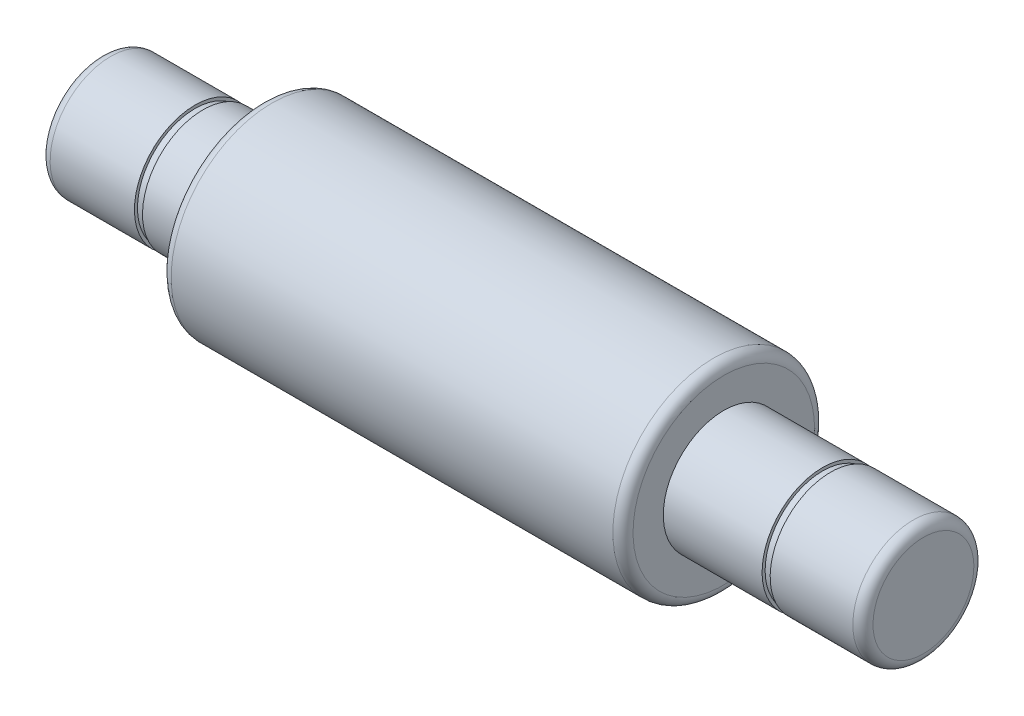
ISO-10303-21;
HEADER;
FILE_DESCRIPTION(('STEP AP214'),'2;1');
FILE_NAME('part.step','',(''),(''),'','','');
FILE_SCHEMA(('AUTOMOTIVE_DESIGN { 1 0 10303 214 1 1 1 1 }'));
ENDSEC;
DATA;
#1=APPLICATION_CONTEXT('core data for automotive mechanical design processes');
#2=APPLICATION_PROTOCOL_DEFINITION('international standard','automotive_design',2000,#1);
#3=PRODUCT_CONTEXT('',#1,'mechanical');
#4=PRODUCT('Part','Part','',(#3));
#5=PRODUCT_RELATED_PRODUCT_CATEGORY('part','',(#4));
#6=PRODUCT_DEFINITION_FORMATION('','',#4);
#7=PRODUCT_DEFINITION_CONTEXT('part definition',#1,'design');
#8=PRODUCT_DEFINITION('design','',#6,#7);
#9=PRODUCT_DEFINITION_SHAPE('','',#8);
#10=(LENGTH_UNIT() NAMED_UNIT(*) SI_UNIT(.MILLI.,.METRE.));
#11=(NAMED_UNIT(*) PLANE_ANGLE_UNIT() SI_UNIT($,.RADIAN.));
#12=(NAMED_UNIT(*) SI_UNIT($,.STERADIAN.) SOLID_ANGLE_UNIT());
#13=UNCERTAINTY_MEASURE_WITH_UNIT(LENGTH_MEASURE(1.E-05),#10,'distance_accuracy_value','');
#14=(GEOMETRIC_REPRESENTATION_CONTEXT(3) GLOBAL_UNCERTAINTY_ASSIGNED_CONTEXT((#13)) GLOBAL_UNIT_ASSIGNED_CONTEXT((#10,
#11,#12)) REPRESENTATION_CONTEXT('',''));
#15=CARTESIAN_POINT('',(0.,0.,0.));
#16=DIRECTION('',(0.,0.,1.));
#17=DIRECTION('',(1.,0.,0.));
#18=AXIS2_PLACEMENT_3D('',#15,#16,#17);
#19=CARTESIAN_POINT('',(-20.4,0.,0.));
#20=DIRECTION('',(-1.,0.,0.));
#21=DIRECTION('',(0.,-1.,0.));
#22=AXIS2_PLACEMENT_3D('',#19,#20,#21);
#23=CYLINDRICAL_SURFACE('',#22,5.);
#24=CARTESIAN_POINT('',(-11.9,0.,0.));
#25=DIRECTION('',(1.,0.,0.));
#26=DIRECTION('',(0.,1.,0.));
#27=AXIS2_PLACEMENT_3D('',#24,#25,#26);
#28=CIRCLE('',#27,5.);
#29=CARTESIAN_POINT('',(-11.9,5.,0.));
#30=VERTEX_POINT('',#29);
#31=EDGE_CURVE('E49',#30,#30,#28,.T.);
#32=ORIENTED_EDGE('',*,*,#31,.T.);
#33=EDGE_LOOP('',(#32));
#34=FACE_BOUND('',#33,.T.);
#35=CARTESIAN_POINT('',(10.,0.,0.));
#36=DIRECTION('',(1.,0.,0.));
#37=DIRECTION('',(0.,1.,0.));
#38=AXIS2_PLACEMENT_3D('',#35,#36,#37);
#39=CIRCLE('',#38,5.);
#40=CARTESIAN_POINT('',(10.,5.,0.));
#41=VERTEX_POINT('',#40);
#42=EDGE_CURVE('E54',#41,#41,#39,.F.);
#43=ORIENTED_EDGE('',*,*,#42,.T.);
#44=EDGE_LOOP('',(#43));
#45=FACE_BOUND('',#44,.T.);
#46=ADVANCED_FACE('F34',(#34,#45),#23,.T.);
#47=CARTESIAN_POINT('',(-12.4,5.,0.));
#48=DIRECTION('',(1.,0.,0.));
#49=DIRECTION('',(0.,1.,0.));
#50=AXIS2_PLACEMENT_3D('',#47,#48,#49);
#51=PLANE('',#50);
#52=CARTESIAN_POINT('',(-12.4,0.,0.));
#53=DIRECTION('',(1.,0.,0.));
#54=DIRECTION('',(0.,1.,0.));
#55=AXIS2_PLACEMENT_3D('',#52,#53,#54);
#56=CIRCLE('',#55,4.5);
#57=CARTESIAN_POINT('',(-12.4,4.5,0.));
#58=VERTEX_POINT('',#57);
#59=EDGE_CURVE('E57',#58,#58,#56,.F.);
#60=ORIENTED_EDGE('',*,*,#59,.T.);
#61=EDGE_LOOP('',(#60));
#62=FACE_BOUND('',#61,.T.);
#63=CARTESIAN_POINT('',(-12.4,0.,0.));
#64=DIRECTION('',(-1.,0.,0.));
#65=DIRECTION('',(0.,-1.,0.));
#66=AXIS2_PLACEMENT_3D('',#63,#64,#65);
#67=CIRCLE('',#66,3.);
#68=CARTESIAN_POINT('',(-12.4,-3.,0.));
#69=VERTEX_POINT('',#68);
#70=EDGE_CURVE('E66',#69,#69,#67,.T.);
#71=ORIENTED_EDGE('',*,*,#70,.F.);
#72=EDGE_LOOP('',(#71));
#73=FACE_BOUND('',#72,.T.);
#74=ADVANCED_FACE('F117',(#62,#73),#51,.F.);
#75=CARTESIAN_POINT('',(-20.4,0.,0.));
#76=DIRECTION('',(-1.,0.,0.));
#77=DIRECTION('',(0.,-1.,0.));
#78=AXIS2_PLACEMENT_3D('',#75,#76,#77);
#79=CYLINDRICAL_SURFACE('',#78,3.);
#80=CARTESIAN_POINT('',(-15.32,0.,0.));
#81=DIRECTION('',(-1.,0.,0.));
#82=DIRECTION('',(0.,-1.,0.));
#83=AXIS2_PLACEMENT_3D('',#80,#81,#82);
#84=CIRCLE('',#83,3.);
#85=CARTESIAN_POINT('',(-15.32,-3.,0.));
#86=VERTEX_POINT('',#85);
#87=EDGE_CURVE('E69',#86,#86,#84,.T.);
#88=ORIENTED_EDGE('',*,*,#87,.F.);
#89=EDGE_LOOP('',(#88));
#90=FACE_BOUND('',#89,.T.);
#91=ORIENTED_EDGE('',*,*,#70,.T.);
#92=EDGE_LOOP('',(#91));
#93=FACE_BOUND('',#92,.T.);
#94=ADVANCED_FACE('F123',(#90,#93),#79,.T.);
#95=CARTESIAN_POINT('',(-15.32,3.,0.));
#96=DIRECTION('',(1.,0.,0.));
#97=DIRECTION('',(0.,1.,0.));
#98=AXIS2_PLACEMENT_3D('',#95,#96,#97);
#99=PLANE('',#98);
#100=CARTESIAN_POINT('',(-15.32,0.,0.));
#101=DIRECTION('',(-1.,0.,0.));
#102=DIRECTION('',(0.,-1.,0.));
#103=AXIS2_PLACEMENT_3D('',#100,#101,#102);
#104=CIRCLE('',#103,2.85);
#105=CARTESIAN_POINT('',(-15.32,-2.85,0.));
#106=VERTEX_POINT('',#105);
#107=EDGE_CURVE('E72',#106,#106,#104,.T.);
#108=ORIENTED_EDGE('',*,*,#107,.F.);
#109=EDGE_LOOP('',(#108));
#110=FACE_BOUND('',#109,.T.);
#111=ORIENTED_EDGE('',*,*,#87,.T.);
#112=EDGE_LOOP('',(#111));
#113=FACE_BOUND('',#112,.T.);
#114=ADVANCED_FACE('F169',(#110,#113),#99,.F.);
#115=CARTESIAN_POINT('',(-20.4,0.,0.));
#116=DIRECTION('',(-1.,0.,0.));
#117=DIRECTION('',(0.,-1.,0.));
#118=AXIS2_PLACEMENT_3D('',#115,#116,#117);
#119=CYLINDRICAL_SURFACE('',#118,2.85);
#120=CARTESIAN_POINT('',(-15.72,0.,0.));
#121=DIRECTION('',(1.,0.,0.));
#122=DIRECTION('',(0.,1.,0.));
#123=AXIS2_PLACEMENT_3D('',#120,#121,#122);
#124=CIRCLE('',#123,2.85);
#125=CARTESIAN_POINT('',(-15.72,2.85,0.));
#126=VERTEX_POINT('',#125);
#127=EDGE_CURVE('E81',#126,#126,#124,.T.);
#128=ORIENTED_EDGE('',*,*,#127,.T.);
#129=EDGE_LOOP('',(#128));
#130=FACE_BOUND('',#129,.T.);
#131=ORIENTED_EDGE('',*,*,#107,.T.);
#132=EDGE_LOOP('',(#131));
#133=FACE_BOUND('',#132,.T.);
#134=ADVANCED_FACE('F165',(#130,#133),#119,.T.);
#135=CARTESIAN_POINT('',(10.5,0.,0.));
#136=DIRECTION('',(1.,0.,0.));
#137=DIRECTION('',(0.,1.,0.));
#138=AXIS2_PLACEMENT_3D('',#135,#136,#137);
#139=PLANE('',#138);
#140=CARTESIAN_POINT('',(10.5,0.,0.));
#141=DIRECTION('',(1.,0.,0.));
#142=DIRECTION('',(0.,1.,0.));
#143=AXIS2_PLACEMENT_3D('',#140,#141,#142);
#144=CIRCLE('',#143,4.5);
#145=CARTESIAN_POINT('',(10.5,4.5,0.));
#146=VERTEX_POINT('',#145);
#147=EDGE_CURVE('E10',#146,#146,#144,.T.);
#148=ORIENTED_EDGE('',*,*,#147,.T.);
#149=EDGE_LOOP('',(#148));
#150=FACE_BOUND('',#149,.T.);
#151=CARTESIAN_POINT('',(10.5,0.,0.));
#152=DIRECTION('',(1.,0.,0.));
#153=DIRECTION('',(0.,1.,0.));
#154=AXIS2_PLACEMENT_3D('',#151,#152,#153);
#155=CIRCLE('',#154,3.);
#156=CARTESIAN_POINT('',(10.5,3.,0.));
#157=VERTEX_POINT('',#156);
#158=EDGE_CURVE('E75',#157,#157,#155,.T.);
#159=ORIENTED_EDGE('',*,*,#158,.F.);
#160=EDGE_LOOP('',(#159));
#161=FACE_BOUND('',#160,.T.);
#162=ADVANCED_FACE('F168',(#150,#161),#139,.T.);
#163=CARTESIAN_POINT('',(-20.4,0.,0.));
#164=DIRECTION('',(-1.,0.,0.));
#165=DIRECTION('',(0.,-1.,0.));
#166=AXIS2_PLACEMENT_3D('',#163,#164,#165);
#167=CYLINDRICAL_SURFACE('',#166,3.);
#168=ORIENTED_EDGE('',*,*,#158,.T.);
#169=EDGE_LOOP('',(#168));
#170=FACE_BOUND('',#169,.T.);
#171=CARTESIAN_POINT('',(15.4,0.,0.));
#172=DIRECTION('',(1.,0.,0.));
#173=DIRECTION('',(0.,1.,0.));
#174=AXIS2_PLACEMENT_3D('',#171,#172,#173);
#175=CIRCLE('',#174,3.);
#176=CARTESIAN_POINT('',(15.4,3.,0.));
#177=VERTEX_POINT('',#176);
#178=EDGE_CURVE('E90',#177,#177,#175,.T.);
#179=ORIENTED_EDGE('',*,*,#178,.F.);
#180=EDGE_LOOP('',(#179));
#181=FACE_BOUND('',#180,.T.);
#182=ADVANCED_FACE('F135',(#170,#181),#167,.T.);
#183=CARTESIAN_POINT('',(-11.9,0.,0.));
#184=DIRECTION('',(1.,0.,0.));
#185=DIRECTION('',(0.,1.,0.));
#186=AXIS2_PLACEMENT_3D('',#183,#184,#185);
#187=TOROIDAL_SURFACE('',#186,4.5,0.5);
#188=ORIENTED_EDGE('',*,*,#31,.F.);
#189=EDGE_LOOP('',(#188));
#190=FACE_BOUND('',#189,.T.);
#191=ORIENTED_EDGE('',*,*,#59,.F.);
#192=EDGE_LOOP('',(#191));
#193=FACE_BOUND('',#192,.T.);
#194=ADVANCED_FACE('F133',(#190,#193),#187,.T.);
#195=CARTESIAN_POINT('',(10.,0.,0.));
#196=DIRECTION('',(1.,0.,0.));
#197=DIRECTION('',(0.,1.,0.));
#198=AXIS2_PLACEMENT_3D('',#195,#196,#197);
#199=TOROIDAL_SURFACE('',#198,4.5,0.5);
#200=ORIENTED_EDGE('',*,*,#42,.F.);
#201=EDGE_LOOP('',(#200));
#202=FACE_BOUND('',#201,.T.);
#203=ORIENTED_EDGE('',*,*,#147,.F.);
#204=EDGE_LOOP('',(#203));
#205=FACE_BOUND('',#204,.T.);
#206=ADVANCED_FACE('F36',(#202,#205),#199,.T.);
#207=CARTESIAN_POINT('',(-15.72,0.,0.));
#208=DIRECTION('',(1.,0.,0.));
#209=DIRECTION('',(0.,1.,0.));
#210=AXIS2_PLACEMENT_3D('',#207,#208,#209);
#211=PLANE('',#210);
#212=CARTESIAN_POINT('',(-15.72,0.,0.));
#213=DIRECTION('',(1.,0.,0.));
#214=DIRECTION('',(0.,1.,0.));
#215=AXIS2_PLACEMENT_3D('',#212,#213,#214);
#216=CIRCLE('',#215,3.);
#217=CARTESIAN_POINT('',(-15.72,3.,0.));
#218=VERTEX_POINT('',#217);
#219=EDGE_CURVE('E78',#218,#218,#216,.T.);
#220=ORIENTED_EDGE('',*,*,#219,.T.);
#221=EDGE_LOOP('',(#220));
#222=FACE_BOUND('',#221,.T.);
#223=ORIENTED_EDGE('',*,*,#127,.F.);
#224=EDGE_LOOP('',(#223));
#225=FACE_BOUND('',#224,.T.);
#226=ADVANCED_FACE('F162',(#222,#225),#211,.T.);
#227=CARTESIAN_POINT('',(-20.4,3.,0.));
#228=DIRECTION('',(1.,0.,0.));
#229=DIRECTION('',(0.,1.,0.));
#230=AXIS2_PLACEMENT_3D('',#227,#228,#229);
#231=PLANE('',#230);
#232=CARTESIAN_POINT('',(-20.4,0.,0.));
#233=DIRECTION('',(1.,0.,0.));
#234=DIRECTION('',(0.,1.,0.));
#235=AXIS2_PLACEMENT_3D('',#232,#233,#234);
#236=CIRCLE('',#235,2.5);
#237=CARTESIAN_POINT('',(-20.4,2.5,0.));
#238=VERTEX_POINT('',#237);
#239=EDGE_CURVE('E63',#238,#238,#236,.F.);
#240=ORIENTED_EDGE('',*,*,#239,.T.);
#241=EDGE_LOOP('',(#240));
#242=FACE_BOUND('',#241,.T.);
#243=ADVANCED_FACE('F131',(#242),#231,.F.);
#244=CARTESIAN_POINT('',(-19.9,0.,0.));
#245=DIRECTION('',(1.,0.,0.));
#246=DIRECTION('',(0.,1.,0.));
#247=AXIS2_PLACEMENT_3D('',#244,#245,#246);
#248=TOROIDAL_SURFACE('',#247,2.5,0.5);
#249=CARTESIAN_POINT('',(-19.9,0.,0.));
#250=DIRECTION('',(1.,0.,0.));
#251=DIRECTION('',(0.,1.,0.));
#252=AXIS2_PLACEMENT_3D('',#249,#250,#251);
#253=CIRCLE('',#252,3.);
#254=CARTESIAN_POINT('',(-19.9,3.,0.));
#255=VERTEX_POINT('',#254);
#256=EDGE_CURVE('E60',#255,#255,#253,.T.);
#257=ORIENTED_EDGE('',*,*,#256,.F.);
#258=EDGE_LOOP('',(#257));
#259=FACE_BOUND('',#258,.T.);
#260=ORIENTED_EDGE('',*,*,#239,.F.);
#261=EDGE_LOOP('',(#260));
#262=FACE_BOUND('',#261,.T.);
#263=ADVANCED_FACE('F112',(#259,#262),#248,.T.);
#264=CARTESIAN_POINT('',(-20.4,0.,0.));
#265=DIRECTION('',(-1.,0.,0.));
#266=DIRECTION('',(0.,-1.,0.));
#267=AXIS2_PLACEMENT_3D('',#264,#265,#266);
#268=CYLINDRICAL_SURFACE('',#267,3.);
#269=ORIENTED_EDGE('',*,*,#256,.T.);
#270=EDGE_LOOP('',(#269));
#271=FACE_BOUND('',#270,.T.);
#272=ORIENTED_EDGE('',*,*,#219,.F.);
#273=EDGE_LOOP('',(#272));
#274=FACE_BOUND('',#273,.T.);
#275=ADVANCED_FACE('F103',(#271,#274),#268,.T.);
#276=CARTESIAN_POINT('',(15.4,0.,0.));
#277=DIRECTION('',(1.,0.,0.));
#278=DIRECTION('',(0.,1.,0.));
#279=AXIS2_PLACEMENT_3D('',#276,#277,#278);
#280=PLANE('',#279);
#281=ORIENTED_EDGE('',*,*,#178,.T.);
#282=EDGE_LOOP('',(#281));
#283=FACE_BOUND('',#282,.T.);
#284=CARTESIAN_POINT('',(15.4,0.,0.));
#285=DIRECTION('',(1.,0.,0.));
#286=DIRECTION('',(0.,1.,0.));
#287=AXIS2_PLACEMENT_3D('',#284,#285,#286);
#288=CIRCLE('',#287,2.85);
#289=CARTESIAN_POINT('',(15.4,2.85,0.));
#290=VERTEX_POINT('',#289);
#291=EDGE_CURVE('E93',#290,#290,#288,.T.);
#292=ORIENTED_EDGE('',*,*,#291,.F.);
#293=EDGE_LOOP('',(#292));
#294=FACE_BOUND('',#293,.T.);
#295=ADVANCED_FACE('F100',(#283,#294),#280,.T.);
#296=CARTESIAN_POINT('',(20.4,3.,0.));
#297=DIRECTION('',(-1.,0.,0.));
#298=DIRECTION('',(0.,-1.,0.));
#299=AXIS2_PLACEMENT_3D('',#296,#297,#298);
#300=PLANE('',#299);
#301=CARTESIAN_POINT('',(20.4,0.,0.));
#302=DIRECTION('',(-1.,0.,0.));
#303=DIRECTION('',(0.,-1.,0.));
#304=AXIS2_PLACEMENT_3D('',#301,#302,#303);
#305=CIRCLE('',#304,2.5);
#306=CARTESIAN_POINT('',(20.4,-2.5,0.));
#307=VERTEX_POINT('',#306);
#308=EDGE_CURVE('E41',#307,#307,#305,.F.);
#309=ORIENTED_EDGE('',*,*,#308,.T.);
#310=EDGE_LOOP('',(#309));
#311=FACE_BOUND('',#310,.T.);
#312=ADVANCED_FACE('F102',(#311),#300,.F.);
#313=CARTESIAN_POINT('',(19.9,0.,0.));
#314=DIRECTION('',(-1.,0.,0.));
#315=DIRECTION('',(0.,-1.,0.));
#316=AXIS2_PLACEMENT_3D('',#313,#314,#315);
#317=TOROIDAL_SURFACE('',#316,2.5,0.5);
#318=ORIENTED_EDGE('',*,*,#308,.F.);
#319=EDGE_LOOP('',(#318));
#320=FACE_BOUND('',#319,.T.);
#321=CARTESIAN_POINT('',(19.9,0.,0.));
#322=DIRECTION('',(-1.,0.,0.));
#323=DIRECTION('',(0.,-1.,0.));
#324=AXIS2_PLACEMENT_3D('',#321,#322,#323);
#325=CIRCLE('',#324,3.);
#326=CARTESIAN_POINT('',(19.9,-3.,0.));
#327=VERTEX_POINT('',#326);
#328=EDGE_CURVE('E45',#327,#327,#325,.T.);
#329=ORIENTED_EDGE('',*,*,#328,.F.);
#330=EDGE_LOOP('',(#329));
#331=FACE_BOUND('',#330,.T.);
#332=ADVANCED_FACE('F110',(#320,#331),#317,.T.);
#333=CARTESIAN_POINT('',(-20.4,0.,0.));
#334=DIRECTION('',(-1.,0.,0.));
#335=DIRECTION('',(0.,-1.,0.));
#336=AXIS2_PLACEMENT_3D('',#333,#334,#335);
#337=CYLINDRICAL_SURFACE('',#336,3.);
#338=ORIENTED_EDGE('',*,*,#328,.T.);
#339=EDGE_LOOP('',(#338));
#340=FACE_BOUND('',#339,.T.);
#341=CARTESIAN_POINT('',(15.8,0.,0.));
#342=DIRECTION('',(-1.,0.,0.));
#343=DIRECTION('',(0.,-1.,0.));
#344=AXIS2_PLACEMENT_3D('',#341,#342,#343);
#345=CIRCLE('',#344,3.);
#346=CARTESIAN_POINT('',(15.8,-3.,0.));
#347=VERTEX_POINT('',#346);
#348=EDGE_CURVE('E84',#347,#347,#345,.T.);
#349=ORIENTED_EDGE('',*,*,#348,.F.);
#350=EDGE_LOOP('',(#349));
#351=FACE_BOUND('',#350,.T.);
#352=ADVANCED_FACE('F138',(#340,#351),#337,.T.);
#353=CARTESIAN_POINT('',(15.8,0.,0.));
#354=DIRECTION('',(-1.,0.,0.));
#355=DIRECTION('',(0.,-1.,0.));
#356=AXIS2_PLACEMENT_3D('',#353,#354,#355);
#357=PLANE('',#356);
#358=ORIENTED_EDGE('',*,*,#348,.T.);
#359=EDGE_LOOP('',(#358));
#360=FACE_BOUND('',#359,.T.);
#361=CARTESIAN_POINT('',(15.8,0.,0.));
#362=DIRECTION('',(-1.,0.,0.));
#363=DIRECTION('',(0.,-1.,0.));
#364=AXIS2_PLACEMENT_3D('',#361,#362,#363);
#365=CIRCLE('',#364,2.85);
#366=CARTESIAN_POINT('',(15.8,-2.85,0.));
#367=VERTEX_POINT('',#366);
#368=EDGE_CURVE('E87',#367,#367,#365,.T.);
#369=ORIENTED_EDGE('',*,*,#368,.F.);
#370=EDGE_LOOP('',(#369));
#371=FACE_BOUND('',#370,.T.);
#372=ADVANCED_FACE('F143',(#360,#371),#357,.T.);
#373=CARTESIAN_POINT('',(-20.4,0.,0.));
#374=DIRECTION('',(-1.,0.,0.));
#375=DIRECTION('',(0.,-1.,0.));
#376=AXIS2_PLACEMENT_3D('',#373,#374,#375);
#377=CYLINDRICAL_SURFACE('',#376,2.85);
#378=ORIENTED_EDGE('',*,*,#291,.T.);
#379=EDGE_LOOP('',(#378));
#380=FACE_BOUND('',#379,.T.);
#381=ORIENTED_EDGE('',*,*,#368,.T.);
#382=EDGE_LOOP('',(#381));
#383=FACE_BOUND('',#382,.T.);
#384=ADVANCED_FACE('F97',(#380,#383),#377,.T.);
#385=CLOSED_SHELL('',(#46,#74,#94,#114,#134,#162,#182,#194,#206,#226,#243,#263,#275,#295,#312,
#332,#352,#372,#384));
#386=MANIFOLD_SOLID_BREP('B2',#385);
#387=ADVANCED_BREP_SHAPE_REPRESENTATION('',(#18,#386),#14);
#388=SHAPE_DEFINITION_REPRESENTATION(#9,#387);
ENDSEC;
END-ISO-10303-21;
